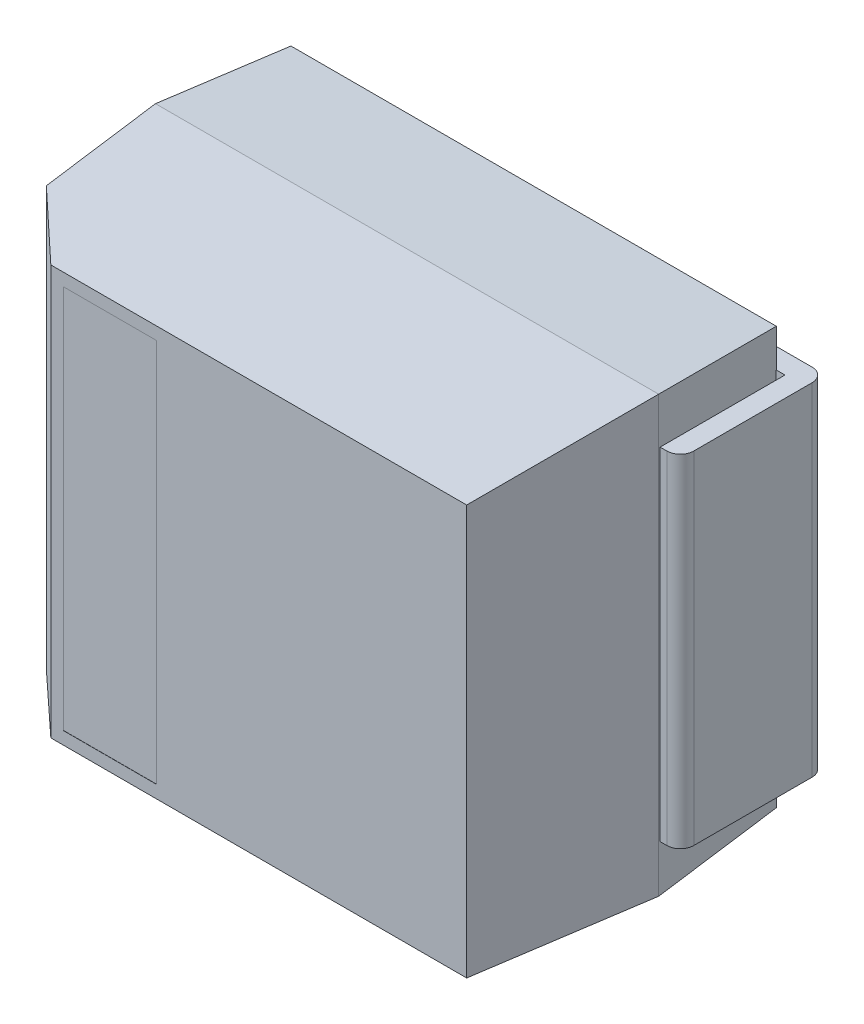
ISO-10303-21;
HEADER;
FILE_DESCRIPTION(('STEP AP214'),'2;1');
FILE_NAME('part.step','',(''),(''),'','','');
FILE_SCHEMA(('AUTOMOTIVE_DESIGN { 1 0 10303 214 1 1 1 1 }'));
ENDSEC;
DATA;
#1=APPLICATION_CONTEXT('core data for automotive mechanical design processes');
#2=APPLICATION_PROTOCOL_DEFINITION('international standard','automotive_design',2000,#1);
#3=PRODUCT_CONTEXT('',#1,'mechanical');
#4=PRODUCT('Part','Part','',(#3));
#5=PRODUCT_RELATED_PRODUCT_CATEGORY('part','',(#4));
#6=PRODUCT_DEFINITION_FORMATION('','',#4);
#7=PRODUCT_DEFINITION_CONTEXT('part definition',#1,'design');
#8=PRODUCT_DEFINITION('design','',#6,#7);
#9=PRODUCT_DEFINITION_SHAPE('','',#8);
#10=(LENGTH_UNIT() NAMED_UNIT(*) SI_UNIT(.MILLI.,.METRE.));
#11=(NAMED_UNIT(*) PLANE_ANGLE_UNIT() SI_UNIT($,.RADIAN.));
#12=(NAMED_UNIT(*) SI_UNIT($,.STERADIAN.) SOLID_ANGLE_UNIT());
#13=UNCERTAINTY_MEASURE_WITH_UNIT(LENGTH_MEASURE(1.E-05),#10,'distance_accuracy_value','');
#14=(GEOMETRIC_REPRESENTATION_CONTEXT(3) GLOBAL_UNCERTAINTY_ASSIGNED_CONTEXT((#13)) GLOBAL_UNIT_ASSIGNED_CONTEXT((#10,
#11,#12)) REPRESENTATION_CONTEXT('',''));
#15=CARTESIAN_POINT('',(0.,0.,0.));
#16=DIRECTION('',(0.,0.,1.));
#17=DIRECTION('',(1.,0.,0.));
#18=AXIS2_PLACEMENT_3D('',#15,#16,#17);
#19=CARTESIAN_POINT('',(-1.75,-1.1,0.));
#20=DIRECTION('',(-1.,0.,0.));
#21=DIRECTION('',(0.,-1.,0.));
#22=AXIS2_PLACEMENT_3D('',#19,#20,#21);
#23=PLANE('',#22);
#24=DIRECTION('',(0.,-1.,0.));
#25=VECTOR('',#24,1.);
#26=CARTESIAN_POINT('',(-1.75,-1.1,0.848883333333));
#27=LINE('',#26,#25);
#28=CARTESIAN_POINT('',(-1.75,0.5,0.848883333333));
#29=VERTEX_POINT('',#28);
#30=CARTESIAN_POINT('',(-1.75,1.1,0.848883333333));
#31=VERTEX_POINT('',#30);
#32=EDGE_CURVE('E170',#29,#31,#27,.F.);
#33=ORIENTED_EDGE('',*,*,#32,.T.);
#34=DIRECTION('',(0.,0.,1.));
#35=VECTOR('',#34,1.);
#36=CARTESIAN_POINT('',(-1.75,1.1,0.));
#37=LINE('',#36,#35);
#38=CARTESIAN_POINT('',(-1.74999999999983,1.1,0.08666666666667));
#39=VERTEX_POINT('',#38);
#40=EDGE_CURVE('E166',#31,#39,#37,.F.);
#41=ORIENTED_EDGE('',*,*,#40,.T.);
#42=DIRECTION('',(0.,1.,0.));
#43=VECTOR('',#42,1.);
#44=CARTESIAN_POINT('',(-1.74999999999967,-1.1,0.08666666666667));
#45=LINE('',#44,#43);
#46=CARTESIAN_POINT('',(-1.74999999999984,-1.1,0.08666666666667));
#47=VERTEX_POINT('',#46);
#48=EDGE_CURVE('E168',#47,#39,#45,.T.);
#49=ORIENTED_EDGE('',*,*,#48,.F.);
#50=DIRECTION('',(0.,0.,1.));
#51=VECTOR('',#50,1.);
#52=CARTESIAN_POINT('',(-1.75,-1.1,0.));
#53=LINE('',#52,#51);
#54=CARTESIAN_POINT('',(-1.75,-1.1,0.848883333333));
#55=VERTEX_POINT('',#54);
#56=EDGE_CURVE('E264',#47,#55,#53,.T.);
#57=ORIENTED_EDGE('',*,*,#56,.T.);
#58=DIRECTION('',(0.,-1.,0.));
#59=VECTOR('',#58,1.);
#60=CARTESIAN_POINT('',(-1.75,-1.1,0.848883333333));
#61=LINE('',#60,#59);
#62=CARTESIAN_POINT('',(-1.75,-0.5,0.848883333333));
#63=VERTEX_POINT('',#62);
#64=EDGE_CURVE('E261',#55,#63,#61,.F.);
#65=ORIENTED_EDGE('',*,*,#64,.T.);
#66=DIRECTION('',(0.,0.,1.));
#67=VECTOR('',#66,1.);
#68=CARTESIAN_POINT('',(-1.75,-0.5,0.));
#69=LINE('',#68,#67);
#70=CARTESIAN_POINT('',(-1.75,-0.5,0.5));
#71=VERTEX_POINT('',#70);
#72=EDGE_CURVE('E263',#63,#71,#69,.F.);
#73=ORIENTED_EDGE('',*,*,#72,.T.);
#74=DIRECTION('',(0.,-1.,0.));
#75=VECTOR('',#74,1.);
#76=CARTESIAN_POINT('',(-1.75,-1.1,0.5));
#77=LINE('',#76,#75);
#78=CARTESIAN_POINT('',(-1.75,0.5,0.5));
#79=VERTEX_POINT('',#78);
#80=EDGE_CURVE('E269',#71,#79,#77,.F.);
#81=ORIENTED_EDGE('',*,*,#80,.T.);
#82=DIRECTION('',(0.,0.,1.));
#83=VECTOR('',#82,1.);
#84=CARTESIAN_POINT('',(-1.75,0.5,0.));
#85=LINE('',#84,#83);
#86=EDGE_CURVE('E274',#79,#29,#85,.T.);
#87=ORIENTED_EDGE('',*,*,#86,.T.);
#88=EDGE_LOOP('',(#33,#41,#49,#57,#65,#73,#81,#87));
#89=FACE_BOUND('',#88,.T.);
#90=ADVANCED_FACE('F16',(#89),#23,.T.);
#91=CARTESIAN_POINT('',(-1.663333333333,-1.1,0.08666666666667));
#92=DIRECTION('',(0.,1.,0.));
#93=DIRECTION('',(-1.,0.,0.));
#94=AXIS2_PLACEMENT_3D('',#91,#92,#93);
#95=CYLINDRICAL_SURFACE('',#94,0.08666666666667);
#96=DIRECTION('',(0.,1.,0.));
#97=VECTOR('',#96,1.);
#98=CARTESIAN_POINT('',(-1.663333333333,0.,0.));
#99=LINE('',#98,#97);
#100=CARTESIAN_POINT('',(-1.663333333333,-1.1,0.));
#101=VERTEX_POINT('',#100);
#102=CARTESIAN_POINT('',(-1.663333333333,1.1,0.));
#103=VERTEX_POINT('',#102);
#104=EDGE_CURVE('E189',#101,#103,#99,.T.);
#105=ORIENTED_EDGE('',*,*,#104,.F.);
#106=CARTESIAN_POINT('',(-1.663333333333,-1.1,0.08666666666667));
#107=DIRECTION('',(0.,1.,0.));
#108=DIRECTION('',(-1.,0.,0.));
#109=AXIS2_PLACEMENT_3D('',#106,#107,#108);
#110=CIRCLE('',#109,0.08666666666667);
#111=EDGE_CURVE('E182',#101,#47,#110,.T.);
#112=ORIENTED_EDGE('',*,*,#111,.T.);
#113=ORIENTED_EDGE('',*,*,#48,.T.);
#114=CARTESIAN_POINT('',(-1.663333333333,1.1,0.08666666666667));
#115=DIRECTION('',(0.,1.,0.));
#116=DIRECTION('',(-1.,0.,0.));
#117=AXIS2_PLACEMENT_3D('',#114,#115,#116);
#118=CIRCLE('',#117,0.08666666666667);
#119=EDGE_CURVE('E20',#39,#103,#118,.F.);
#120=ORIENTED_EDGE('',*,*,#119,.T.);
#121=EDGE_LOOP('',(#105,#112,#113,#120));
#122=FACE_BOUND('',#121,.T.);
#123=ADVANCED_FACE('F179',(#122),#95,.T.);
#124=CARTESIAN_POINT('',(1.241666666667,0.,0.));
#125=DIRECTION('',(0.,0.,-1.));
#126=DIRECTION('',(-1.,0.,0.));
#127=AXIS2_PLACEMENT_3D('',#124,#125,#126);
#128=PLANE('',#127);
#129=DIRECTION('',(0.,-1.,0.));
#130=VECTOR('',#129,1.);
#131=CARTESIAN_POINT('',(1.663333333333,1.1,0.));
#132=LINE('',#131,#130);
#133=CARTESIAN_POINT('',(1.663333333333,-1.1,0.));
#134=VERTEX_POINT('',#133);
#135=CARTESIAN_POINT('',(1.663333333333,1.1,0.));
#136=VERTEX_POINT('',#135);
#137=EDGE_CURVE('E194',#134,#136,#132,.F.);
#138=ORIENTED_EDGE('',*,*,#137,.F.);
#139=DIRECTION('',(-1.,0.,0.));
#140=VECTOR('',#139,1.);
#141=CARTESIAN_POINT('',(1.241666666667,-1.1,0.));
#142=LINE('',#141,#140);
#143=EDGE_CURVE('E195',#134,#101,#142,.T.);
#144=ORIENTED_EDGE('',*,*,#143,.T.);
#145=ORIENTED_EDGE('',*,*,#104,.T.);
#146=DIRECTION('',(-1.,0.,0.));
#147=VECTOR('',#146,1.);
#148=CARTESIAN_POINT('',(1.241666666667,1.1,0.));
#149=LINE('',#148,#147);
#150=EDGE_CURVE('E188',#103,#136,#149,.F.);
#151=ORIENTED_EDGE('',*,*,#150,.T.);
#152=EDGE_LOOP('',(#138,#144,#145,#151));
#153=FACE_BOUND('',#152,.T.);
#154=ADVANCED_FACE('F881',(#153),#128,.T.);
#155=CARTESIAN_POINT('',(1.663333333333,1.1,0.08666666666667));
#156=DIRECTION('',(0.,-1.,0.));
#157=DIRECTION('',(1.,0.,0.));
#158=AXIS2_PLACEMENT_3D('',#155,#156,#157);
#159=CYLINDRICAL_SURFACE('',#158,0.08666666666667);
#160=ORIENTED_EDGE('',*,*,#137,.T.);
#161=CARTESIAN_POINT('',(1.663333333333,1.1,0.08666666666667));
#162=DIRECTION('',(0.,-1.,0.));
#163=DIRECTION('',(1.,0.,0.));
#164=AXIS2_PLACEMENT_3D('',#161,#162,#163);
#165=CIRCLE('',#164,0.08666666666667);
#166=CARTESIAN_POINT('',(1.75,1.1,0.08666666666667));
#167=VERTEX_POINT('',#166);
#168=EDGE_CURVE('E196',#136,#167,#165,.T.);
#169=ORIENTED_EDGE('',*,*,#168,.T.);
#170=DIRECTION('',(0.,1.,0.));
#171=VECTOR('',#170,1.);
#172=CARTESIAN_POINT('',(1.75,1.1,0.08666666666667));
#173=LINE('',#172,#171);
#174=CARTESIAN_POINT('',(1.75,-1.1,0.08666666666667));
#175=VERTEX_POINT('',#174);
#176=EDGE_CURVE('E202',#175,#167,#173,.T.);
#177=ORIENTED_EDGE('',*,*,#176,.F.);
#178=CARTESIAN_POINT('',(1.663333333333,-1.1,0.08666666666667));
#179=DIRECTION('',(0.,-1.,0.));
#180=DIRECTION('',(1.,0.,0.));
#181=AXIS2_PLACEMENT_3D('',#178,#179,#180);
#182=CIRCLE('',#181,0.08666666666667);
#183=EDGE_CURVE('E192',#175,#134,#182,.F.);
#184=ORIENTED_EDGE('',*,*,#183,.T.);
#185=EDGE_LOOP('',(#160,#169,#177,#184));
#186=FACE_BOUND('',#185,.T.);
#187=ADVANCED_FACE('F871',(#186),#159,.T.);
#188=CARTESIAN_POINT('',(1.75,1.1,0.));
#189=DIRECTION('',(1.,0.,0.));
#190=DIRECTION('',(0.,1.,0.));
#191=AXIS2_PLACEMENT_3D('',#188,#189,#190);
#192=PLANE('',#191);
#193=DIRECTION('',(0.,0.,1.));
#194=VECTOR('',#193,1.);
#195=CARTESIAN_POINT('',(1.75,-1.1,0.));
#196=LINE('',#195,#194);
#197=CARTESIAN_POINT('',(1.74999999999983,-1.1,0.848883333333));
#198=VERTEX_POINT('',#197);
#199=EDGE_CURVE('E290',#198,#175,#196,.F.);
#200=ORIENTED_EDGE('',*,*,#199,.T.);
#201=ORIENTED_EDGE('',*,*,#176,.T.);
#202=DIRECTION('',(0.,0.,1.));
#203=VECTOR('',#202,1.);
#204=CARTESIAN_POINT('',(1.75,1.1,0.));
#205=LINE('',#204,#203);
#206=CARTESIAN_POINT('',(1.74999999999984,1.1,0.848883333333));
#207=VERTEX_POINT('',#206);
#208=EDGE_CURVE('E198',#167,#207,#205,.T.);
#209=ORIENTED_EDGE('',*,*,#208,.T.);
#210=DIRECTION('',(0.,-1.,0.));
#211=VECTOR('',#210,1.);
#212=CARTESIAN_POINT('',(1.74999999999967,1.1,0.848883333333));
#213=LINE('',#212,#211);
#214=EDGE_CURVE('E204',#198,#207,#213,.F.);
#215=ORIENTED_EDGE('',*,*,#214,.F.);
#216=EDGE_LOOP('',(#200,#201,#209,#215));
#217=FACE_BOUND('',#216,.T.);
#218=ADVANCED_FACE('F861',(#217),#192,.T.);
#219=CARTESIAN_POINT('',(1.663333333333,1.1,0.848883333333));
#220=DIRECTION('',(0.,-1.,0.));
#221=DIRECTION('',(1.,0.,0.));
#222=AXIS2_PLACEMENT_3D('',#219,#220,#221);
#223=CYLINDRICAL_SURFACE('',#222,0.08666666666667);
#224=CARTESIAN_POINT('',(1.663333333333,-1.1,0.848883333333));
#225=DIRECTION('',(0.,-1.,0.));
#226=DIRECTION('',(1.,0.,0.));
#227=AXIS2_PLACEMENT_3D('',#224,#225,#226);
#228=CIRCLE('',#227,0.08666666666667);
#229=CARTESIAN_POINT('',(1.663333333333,-1.1,0.93555));
#230=VERTEX_POINT('',#229);
#231=EDGE_CURVE('E201',#230,#198,#228,.F.);
#232=ORIENTED_EDGE('',*,*,#231,.T.);
#233=ORIENTED_EDGE('',*,*,#214,.T.);
#234=CARTESIAN_POINT('',(1.663333333333,1.1,0.848883333333));
#235=DIRECTION('',(0.,-1.,0.));
#236=DIRECTION('',(1.,0.,0.));
#237=AXIS2_PLACEMENT_3D('',#234,#235,#236);
#238=CIRCLE('',#237,0.08666666666667);
#239=CARTESIAN_POINT('',(1.663333333333,1.1,0.93555));
#240=VERTEX_POINT('',#239);
#241=EDGE_CURVE('E199',#207,#240,#238,.T.);
#242=ORIENTED_EDGE('',*,*,#241,.T.);
#243=DIRECTION('',(0.,1.,0.));
#244=VECTOR('',#243,1.);
#245=CARTESIAN_POINT('',(1.663333333333,0.,0.93555));
#246=LINE('',#245,#244);
#247=EDGE_CURVE('E296',#240,#230,#246,.F.);
#248=ORIENTED_EDGE('',*,*,#247,.T.);
#249=EDGE_LOOP('',(#232,#233,#242,#248));
#250=FACE_BOUND('',#249,.T.);
#251=ADVANCED_FACE('F851',(#250),#223,.T.);
#252=CARTESIAN_POINT('',(-1.75,0.5,0.5));
#253=DIRECTION('',(0.,1.,0.));
#254=DIRECTION('',(-1.,0.,0.));
#255=AXIS2_PLACEMENT_3D('',#252,#253,#254);
#256=PLANE('',#255);
#257=DIRECTION('',(-1.,0.,0.));
#258=VECTOR('',#257,1.);
#259=CARTESIAN_POINT('',(-1.685,0.5,0.93555));
#260=LINE('',#259,#258);
#261=CARTESIAN_POINT('',(-1.62,0.5,0.93555));
#262=VERTEX_POINT('',#261);
#263=CARTESIAN_POINT('',(-1.663333333333,0.5,0.93555));
#264=VERTEX_POINT('',#263);
#265=EDGE_CURVE('E207',#262,#264,#260,.T.);
#266=ORIENTED_EDGE('',*,*,#265,.T.);
#267=CARTESIAN_POINT('',(-1.663333333333,0.5,0.848883333333));
#268=DIRECTION('',(0.,1.,0.));
#269=DIRECTION('',(-1.,0.,0.));
#270=AXIS2_PLACEMENT_3D('',#267,#268,#269);
#271=CIRCLE('',#270,0.08666666666667);
#272=EDGE_CURVE('E205',#29,#264,#271,.T.);
#273=ORIENTED_EDGE('',*,*,#272,.F.);
#274=ORIENTED_EDGE('',*,*,#86,.F.);
#275=DIRECTION('',(-1.,0.,0.));
#276=VECTOR('',#275,1.);
#277=CARTESIAN_POINT('',(-1.685,0.5,0.5));
#278=LINE('',#277,#276);
#279=CARTESIAN_POINT('',(-1.62,0.5,0.5));
#280=VERTEX_POINT('',#279);
#281=EDGE_CURVE('E294',#79,#280,#278,.F.);
#282=ORIENTED_EDGE('',*,*,#281,.T.);
#283=DIRECTION('',(0.,0.,1.));
#284=VECTOR('',#283,1.);
#285=CARTESIAN_POINT('',(-1.62,0.5,0.));
#286=LINE('',#285,#284);
#287=EDGE_CURVE('E307',#262,#280,#286,.F.);
#288=ORIENTED_EDGE('',*,*,#287,.F.);
#289=EDGE_LOOP('',(#266,#273,#274,#282,#288));
#290=FACE_BOUND('',#289,.T.);
#291=ADVANCED_FACE('F841',(#290),#256,.F.);
#292=CARTESIAN_POINT('',(-1.685,0.,0.5));
#293=DIRECTION('',(0.,0.,-1.));
#294=DIRECTION('',(-1.,0.,0.));
#295=AXIS2_PLACEMENT_3D('',#292,#293,#294);
#296=PLANE('',#295);
#297=ORIENTED_EDGE('',*,*,#281,.F.);
#298=ORIENTED_EDGE('',*,*,#80,.F.);
#299=DIRECTION('',(1.,0.,0.));
#300=VECTOR('',#299,1.);
#301=CARTESIAN_POINT('',(-1.62,-0.5,0.5));
#302=LINE('',#301,#300);
#303=CARTESIAN_POINT('',(-1.62,-0.5,0.5));
#304=VERTEX_POINT('',#303);
#305=EDGE_CURVE('E316',#71,#304,#302,.T.);
#306=ORIENTED_EDGE('',*,*,#305,.T.);
#307=DIRECTION('',(0.,1.,0.));
#308=VECTOR('',#307,1.);
#309=CARTESIAN_POINT('',(-1.62,1.1,0.5));
#310=LINE('',#309,#308);
#311=EDGE_CURVE('E310',#280,#304,#310,.F.);
#312=ORIENTED_EDGE('',*,*,#311,.F.);
#313=EDGE_LOOP('',(#297,#298,#306,#312));
#314=FACE_BOUND('',#313,.T.);
#315=ADVANCED_FACE('F831',(#314),#296,.F.);
#316=CARTESIAN_POINT('',(-1.62,-0.5,0.5));
#317=DIRECTION('',(0.,-1.,0.));
#318=DIRECTION('',(1.,0.,0.));
#319=AXIS2_PLACEMENT_3D('',#316,#317,#318);
#320=PLANE('',#319);
#321=CARTESIAN_POINT('',(-1.663333333333,-0.5,0.848883333333));
#322=DIRECTION('',(0.,1.,0.));
#323=DIRECTION('',(-1.,0.,0.));
#324=AXIS2_PLACEMENT_3D('',#321,#322,#323);
#325=CIRCLE('',#324,0.08666666666667);
#326=CARTESIAN_POINT('',(-1.663333333333,-0.5,0.935549999999835));
#327=VERTEX_POINT('',#326);
#328=EDGE_CURVE('E209',#327,#63,#325,.F.);
#329=ORIENTED_EDGE('',*,*,#328,.F.);
#330=DIRECTION('',(-1.,0.,0.));
#331=VECTOR('',#330,1.);
#332=CARTESIAN_POINT('',(-1.685,-0.5,0.93555));
#333=LINE('',#332,#331);
#334=CARTESIAN_POINT('',(-1.62,-0.5,0.93555));
#335=VERTEX_POINT('',#334);
#336=EDGE_CURVE('E333',#327,#335,#333,.F.);
#337=ORIENTED_EDGE('',*,*,#336,.T.);
#338=DIRECTION('',(0.,0.,1.));
#339=VECTOR('',#338,1.);
#340=CARTESIAN_POINT('',(-1.62,-0.5,0.));
#341=LINE('',#340,#339);
#342=EDGE_CURVE('E321',#304,#335,#341,.T.);
#343=ORIENTED_EDGE('',*,*,#342,.F.);
#344=ORIENTED_EDGE('',*,*,#305,.F.);
#345=ORIENTED_EDGE('',*,*,#72,.F.);
#346=EDGE_LOOP('',(#329,#337,#343,#344,#345));
#347=FACE_BOUND('',#346,.T.);
#348=ADVANCED_FACE('F821',(#347),#320,.F.);
#349=CARTESIAN_POINT('',(1.685,0.,0.93555));
#350=DIRECTION('',(0.,0.,-1.));
#351=DIRECTION('',(-1.,0.,0.));
#352=AXIS2_PLACEMENT_3D('',#349,#350,#351);
#353=PLANE('',#352);
#354=DIRECTION('',(-1.,0.,0.));
#355=VECTOR('',#354,1.);
#356=CARTESIAN_POINT('',(1.685,-1.1,0.93555));
#357=LINE('',#356,#355);
#358=CARTESIAN_POINT('',(1.62,-1.1,0.93555));
#359=VERTEX_POINT('',#358);
#360=EDGE_CURVE('E208',#230,#359,#357,.T.);
#361=ORIENTED_EDGE('',*,*,#360,.F.);
#362=ORIENTED_EDGE('',*,*,#247,.F.);
#363=DIRECTION('',(-1.,0.,0.));
#364=VECTOR('',#363,1.);
#365=CARTESIAN_POINT('',(1.685,1.1,0.93555));
#366=LINE('',#365,#364);
#367=CARTESIAN_POINT('',(1.62,1.1,0.93555));
#368=VERTEX_POINT('',#367);
#369=EDGE_CURVE('E299',#368,#240,#366,.F.);
#370=ORIENTED_EDGE('',*,*,#369,.F.);
#371=DIRECTION('',(0.,-1.,0.));
#372=VECTOR('',#371,1.);
#373=CARTESIAN_POINT('',(1.62,-1.1,0.93555));
#374=LINE('',#373,#372);
#375=EDGE_CURVE('E212',#359,#368,#374,.F.);
#376=ORIENTED_EDGE('',*,*,#375,.F.);
#377=EDGE_LOOP('',(#361,#362,#370,#376));
#378=FACE_BOUND('',#377,.T.);
#379=ADVANCED_FACE('F811',(#378),#353,.F.);
#380=CARTESIAN_POINT('',(-1.663333333333,-1.1,0.848883333333));
#381=DIRECTION('',(0.,1.,0.));
#382=DIRECTION('',(-1.,0.,0.));
#383=AXIS2_PLACEMENT_3D('',#380,#381,#382);
#384=CYLINDRICAL_SURFACE('',#383,0.08666666666667);
#385=DIRECTION('',(0.,1.,0.));
#386=VECTOR('',#385,1.);
#387=CARTESIAN_POINT('',(-1.663333333333,0.,0.93555));
#388=LINE('',#387,#386);
#389=CARTESIAN_POINT('',(-1.663333333333,1.1,0.93555));
#390=VERTEX_POINT('',#389);
#391=EDGE_CURVE('E304',#264,#390,#388,.T.);
#392=ORIENTED_EDGE('',*,*,#391,.T.);
#393=CARTESIAN_POINT('',(-1.663333333333,1.1,0.848883333333));
#394=DIRECTION('',(0.,1.,0.));
#395=DIRECTION('',(-1.,0.,0.));
#396=AXIS2_PLACEMENT_3D('',#393,#394,#395);
#397=CIRCLE('',#396,0.08666666666667);
#398=EDGE_CURVE('E214',#31,#390,#397,.T.);
#399=ORIENTED_EDGE('',*,*,#398,.F.);
#400=ORIENTED_EDGE('',*,*,#32,.F.);
#401=ORIENTED_EDGE('',*,*,#272,.T.);
#402=EDGE_LOOP('',(#392,#399,#400,#401));
#403=FACE_BOUND('',#402,.T.);
#404=ADVANCED_FACE('F801',(#403),#384,.T.);
#405=CARTESIAN_POINT('',(-1.685,0.,0.93555));
#406=DIRECTION('',(0.,0.,-1.));
#407=DIRECTION('',(-1.,0.,0.));
#408=AXIS2_PLACEMENT_3D('',#405,#406,#407);
#409=PLANE('',#408);
#410=DIRECTION('',(-1.,0.,0.));
#411=VECTOR('',#410,1.);
#412=CARTESIAN_POINT('',(-1.45087948265,1.1,0.93555));
#413=LINE('',#412,#411);
#414=CARTESIAN_POINT('',(-1.62,1.1,0.93555));
#415=VERTEX_POINT('',#414);
#416=EDGE_CURVE('E216',#390,#415,#413,.F.);
#417=ORIENTED_EDGE('',*,*,#416,.F.);
#418=ORIENTED_EDGE('',*,*,#391,.F.);
#419=ORIENTED_EDGE('',*,*,#265,.F.);
#420=DIRECTION('',(0.,1.,0.));
#421=VECTOR('',#420,1.);
#422=CARTESIAN_POINT('',(-1.62,1.1,0.93555));
#423=LINE('',#422,#421);
#424=EDGE_CURVE('E311',#415,#262,#423,.F.);
#425=ORIENTED_EDGE('',*,*,#424,.F.);
#426=EDGE_LOOP('',(#417,#418,#419,#425));
#427=FACE_BOUND('',#426,.T.);
#428=ADVANCED_FACE('F791',(#427),#409,.F.);
#429=CARTESIAN_POINT('',(-1.62,1.1,0.));
#430=DIRECTION('',(1.,0.,0.));
#431=DIRECTION('',(0.,1.,0.));
#432=AXIS2_PLACEMENT_3D('',#429,#430,#431);
#433=PLANE('',#432);
#434=DIRECTION('',(0.,1.,0.));
#435=VECTOR('',#434,1.);
#436=CARTESIAN_POINT('',(-1.62,0.,0.93555));
#437=LINE('',#436,#435);
#438=CARTESIAN_POINT('',(-1.62,-1.1,0.93555));
#439=VERTEX_POINT('',#438);
#440=EDGE_CURVE('E336',#335,#439,#437,.F.);
#441=ORIENTED_EDGE('',*,*,#440,.T.);
#442=DIRECTION('',(0.,0.,1.));
#443=VECTOR('',#442,1.);
#444=CARTESIAN_POINT('',(-1.62,-1.1,0.));
#445=LINE('',#444,#443);
#446=CARTESIAN_POINT('',(-1.62,-1.1,0.1313));
#447=VERTEX_POINT('',#446);
#448=EDGE_CURVE('E330',#439,#447,#445,.F.);
#449=ORIENTED_EDGE('',*,*,#448,.T.);
#450=DIRECTION('',(0.,1.,0.));
#451=VECTOR('',#450,1.);
#452=CARTESIAN_POINT('',(-1.62,0.,0.1313));
#453=LINE('',#452,#451);
#454=CARTESIAN_POINT('',(-1.62,1.1,0.1313));
#455=VERTEX_POINT('',#454);
#456=EDGE_CURVE('E359',#447,#455,#453,.T.);
#457=ORIENTED_EDGE('',*,*,#456,.T.);
#458=DIRECTION('',(0.,0.,1.));
#459=VECTOR('',#458,1.);
#460=CARTESIAN_POINT('',(-1.62,1.1,0.291674963104));
#461=LINE('',#460,#459);
#462=EDGE_CURVE('E356',#415,#455,#461,.F.);
#463=ORIENTED_EDGE('',*,*,#462,.F.);
#464=ORIENTED_EDGE('',*,*,#424,.T.);
#465=ORIENTED_EDGE('',*,*,#287,.T.);
#466=ORIENTED_EDGE('',*,*,#311,.T.);
#467=ORIENTED_EDGE('',*,*,#342,.T.);
#468=EDGE_LOOP('',(#441,#449,#457,#463,#464,#465,#466,#467));
#469=FACE_BOUND('',#468,.T.);
#470=ADVANCED_FACE('F781',(#469),#433,.T.);
#471=CARTESIAN_POINT('',(-1.685,0.,0.93555));
#472=DIRECTION('',(0.,0.,-1.));
#473=DIRECTION('',(-1.,0.,0.));
#474=AXIS2_PLACEMENT_3D('',#471,#472,#473);
#475=PLANE('',#474);
#476=ORIENTED_EDGE('',*,*,#336,.F.);
#477=DIRECTION('',(0.,1.,0.));
#478=VECTOR('',#477,1.);
#479=CARTESIAN_POINT('',(-1.663333333333,-1.1,0.93554999999967));
#480=LINE('',#479,#478);
#481=CARTESIAN_POINT('',(-1.663333333333,-1.1,0.935549999999835));
#482=VERTEX_POINT('',#481);
#483=EDGE_CURVE('E213',#482,#327,#480,.T.);
#484=ORIENTED_EDGE('',*,*,#483,.F.);
#485=DIRECTION('',(1.,0.,0.));
#486=VECTOR('',#485,1.);
#487=CARTESIAN_POINT('',(-1.45087948265,-1.1,0.93555));
#488=LINE('',#487,#486);
#489=EDGE_CURVE('E222',#439,#482,#488,.F.);
#490=ORIENTED_EDGE('',*,*,#489,.F.);
#491=ORIENTED_EDGE('',*,*,#440,.F.);
#492=EDGE_LOOP('',(#476,#484,#490,#491));
#493=FACE_BOUND('',#492,.T.);
#494=ADVANCED_FACE('F771',(#493),#475,.F.);
#495=CARTESIAN_POINT('',(-1.663333333333,-1.1,0.848883333333));
#496=DIRECTION('',(0.,1.,0.));
#497=DIRECTION('',(-1.,0.,0.));
#498=AXIS2_PLACEMENT_3D('',#495,#496,#497);
#499=CYLINDRICAL_SURFACE('',#498,0.08666666666667);
#500=ORIENTED_EDGE('',*,*,#483,.T.);
#501=ORIENTED_EDGE('',*,*,#328,.T.);
#502=ORIENTED_EDGE('',*,*,#64,.F.);
#503=CARTESIAN_POINT('',(-1.663333333333,-1.1,0.848883333333));
#504=DIRECTION('',(0.,1.,0.));
#505=DIRECTION('',(-1.,0.,0.));
#506=AXIS2_PLACEMENT_3D('',#503,#504,#505);
#507=CIRCLE('',#506,0.08666666666667);
#508=EDGE_CURVE('E218',#482,#55,#507,.F.);
#509=ORIENTED_EDGE('',*,*,#508,.F.);
#510=EDGE_LOOP('',(#500,#501,#502,#509));
#511=FACE_BOUND('',#510,.T.);
#512=ADVANCED_FACE('F761',(#511),#499,.T.);
#513=CARTESIAN_POINT('',(1.62,-1.1,0.));
#514=DIRECTION('',(-1.,0.,0.));
#515=DIRECTION('',(0.,-1.,0.));
#516=AXIS2_PLACEMENT_3D('',#513,#514,#515);
#517=PLANE('',#516);
#518=ORIENTED_EDGE('',*,*,#375,.T.);
#519=DIRECTION('',(0.,0.,1.));
#520=VECTOR('',#519,1.);
#521=CARTESIAN_POINT('',(1.62,1.1,0.));
#522=LINE('',#521,#520);
#523=CARTESIAN_POINT('',(1.62,1.1,0.1313));
#524=VERTEX_POINT('',#523);
#525=EDGE_CURVE('E217',#368,#524,#522,.F.);
#526=ORIENTED_EDGE('',*,*,#525,.T.);
#527=DIRECTION('',(0.,1.,0.));
#528=VECTOR('',#527,1.);
#529=CARTESIAN_POINT('',(1.62,0.,0.1313));
#530=LINE('',#529,#528);
#531=CARTESIAN_POINT('',(1.62,-1.1,0.1313));
#532=VERTEX_POINT('',#531);
#533=EDGE_CURVE('E384',#524,#532,#530,.F.);
#534=ORIENTED_EDGE('',*,*,#533,.T.);
#535=DIRECTION('',(0.,0.,1.));
#536=VECTOR('',#535,1.);
#537=CARTESIAN_POINT('',(1.62,-1.1,0.291674963104));
#538=LINE('',#537,#536);
#539=EDGE_CURVE('E381',#359,#532,#538,.F.);
#540=ORIENTED_EDGE('',*,*,#539,.F.);
#541=EDGE_LOOP('',(#518,#526,#534,#540));
#542=FACE_BOUND('',#541,.T.);
#543=ADVANCED_FACE('F751',(#542),#517,.T.);
#544=CARTESIAN_POINT('',(-1.22,0.,0.1313));
#545=DIRECTION('',(0.,0.,-1.));
#546=DIRECTION('',(-1.,0.,0.));
#547=AXIS2_PLACEMENT_3D('',#544,#545,#546);
#548=PLANE('',#547);
#549=ORIENTED_EDGE('',*,*,#456,.F.);
#550=DIRECTION('',(1.,0.,0.));
#551=VECTOR('',#550,1.);
#552=CARTESIAN_POINT('',(-1.45087948265,-1.1,0.1313));
#553=LINE('',#552,#551);
#554=CARTESIAN_POINT('',(-1.56282096140155,-1.1,0.131299999999981));
#555=VERTEX_POINT('',#554);
#556=EDGE_CURVE('E398',#555,#447,#553,.F.);
#557=ORIENTED_EDGE('',*,*,#556,.F.);
#558=DIRECTION('',(0.,-1.,0.));
#559=VECTOR('',#558,1.);
#560=CARTESIAN_POINT('',(-1.56282096140155,0.,0.131299999999961));
#561=LINE('',#560,#559);
#562=CARTESIAN_POINT('',(-1.56282096140155,1.1,0.131299999999981));
#563=VERTEX_POINT('',#562);
#564=EDGE_CURVE('E225',#563,#555,#561,.T.);
#565=ORIENTED_EDGE('',*,*,#564,.F.);
#566=DIRECTION('',(-1.,0.,0.));
#567=VECTOR('',#566,1.);
#568=CARTESIAN_POINT('',(-1.22,1.1,0.1313));
#569=LINE('',#568,#567);
#570=EDGE_CURVE('E364',#455,#563,#569,.F.);
#571=ORIENTED_EDGE('',*,*,#570,.F.);
#572=EDGE_LOOP('',(#549,#557,#565,#571));
#573=FACE_BOUND('',#572,.T.);
#574=ADVANCED_FACE('F741',(#573),#548,.F.);
#575=CARTESIAN_POINT('',(1.562729609859,-1.342729609859,0.13));
#576=DIRECTION('',(0.,0.,-1.));
#577=DIRECTION('',(-1.,0.,0.));
#578=AXIS2_PLACEMENT_3D('',#575,#576,#577);
#579=PLANE('',#578);
#580=DIRECTION('',(0.,-1.,0.));
#581=VECTOR('',#580,1.);
#582=CARTESIAN_POINT('',(-1.562729609859,0.,0.13));
#583=LINE('',#582,#581);
#584=CARTESIAN_POINT('',(-1.562729609859,1.342729609859,0.13));
#585=VERTEX_POINT('',#584);
#586=CARTESIAN_POINT('',(-1.562729609859,1.1,0.13));
#587=VERTEX_POINT('',#586);
#588=EDGE_CURVE('E226',#585,#587,#583,.T.);
#589=ORIENTED_EDGE('',*,*,#588,.F.);
#590=DIRECTION('',(-1.,0.,0.));
#591=VECTOR('',#590,1.);
#592=CARTESIAN_POINT('',(0.,1.342729609859,0.13));
#593=LINE('',#592,#591);
#594=CARTESIAN_POINT('',(1.562729609859,1.342729609859,0.13));
#595=VERTEX_POINT('',#594);
#596=EDGE_CURVE('E429',#595,#585,#593,.T.);
#597=ORIENTED_EDGE('',*,*,#596,.F.);
#598=DIRECTION('',(0.,1.,0.));
#599=VECTOR('',#598,1.);
#600=CARTESIAN_POINT('',(1.562729609859,-1.342729609859,0.13));
#601=LINE('',#600,#599);
#602=CARTESIAN_POINT('',(1.562729609859,1.1,0.13));
#603=VERTEX_POINT('',#602);
#604=EDGE_CURVE('E221',#595,#603,#601,.F.);
#605=ORIENTED_EDGE('',*,*,#604,.T.);
#606=DIRECTION('',(-1.,0.,0.));
#607=VECTOR('',#606,1.);
#608=CARTESIAN_POINT('',(1.45087948265,1.1,0.13));
#609=LINE('',#608,#607);
#610=EDGE_CURVE('E418',#587,#603,#609,.F.);
#611=ORIENTED_EDGE('',*,*,#610,.F.);
#612=EDGE_LOOP('',(#589,#597,#605,#611));
#613=FACE_BOUND('',#612,.T.);
#614=ADVANCED_FACE('F731',(#613),#579,.T.);
#615=CARTESIAN_POINT('',(1.45087948265,-1.1,0.291674963104));
#616=DIRECTION('',(0.,-1.,0.));
#617=DIRECTION('',(1.,0.,0.));
#618=AXIS2_PLACEMENT_3D('',#615,#616,#617);
#619=PLANE('',#618);
#620=DIRECTION('',(-1.,0.,0.));
#621=VECTOR('',#620,1.);
#622=CARTESIAN_POINT('',(1.562729609859,-1.1,0.13));
#623=LINE('',#622,#621);
#624=CARTESIAN_POINT('',(-1.562729609859,-1.1,0.13));
#625=VERTEX_POINT('',#624);
#626=CARTESIAN_POINT('',(1.562729609859,-1.1,0.13));
#627=VERTEX_POINT('',#626);
#628=EDGE_CURVE('E411',#625,#627,#623,.F.);
#629=ORIENTED_EDGE('',*,*,#628,.F.);
#630=DIRECTION('',(-0.0700975619934905,0.,0.997540140446774));
#631=VECTOR('',#630,1.);
#632=CARTESIAN_POINT('',(-1.562729609859,-1.1,0.13));
#633=LINE('',#632,#631);
#634=EDGE_CURVE('E227',#555,#625,#633,.F.);
#635=ORIENTED_EDGE('',*,*,#634,.F.);
#636=ORIENTED_EDGE('',*,*,#556,.T.);
#637=ORIENTED_EDGE('',*,*,#448,.F.);
#638=ORIENTED_EDGE('',*,*,#489,.T.);
#639=ORIENTED_EDGE('',*,*,#508,.T.);
#640=ORIENTED_EDGE('',*,*,#56,.F.);
#641=ORIENTED_EDGE('',*,*,#111,.F.);
#642=ORIENTED_EDGE('',*,*,#143,.F.);
#643=ORIENTED_EDGE('',*,*,#183,.F.);
#644=ORIENTED_EDGE('',*,*,#199,.F.);
#645=ORIENTED_EDGE('',*,*,#231,.F.);
#646=ORIENTED_EDGE('',*,*,#360,.T.);
#647=ORIENTED_EDGE('',*,*,#539,.T.);
#648=DIRECTION('',(-1.,0.,0.));
#649=VECTOR('',#648,1.);
#650=CARTESIAN_POINT('',(1.22,-1.1,0.1313));
#651=LINE('',#650,#649);
#652=CARTESIAN_POINT('',(1.56282096140155,-1.1,0.131299999999981));
#653=VERTEX_POINT('',#652);
#654=EDGE_CURVE('E389',#532,#653,#651,.T.);
#655=ORIENTED_EDGE('',*,*,#654,.T.);
#656=DIRECTION('',(0.0700975619934905,0.,0.997540140446774));
#657=VECTOR('',#656,1.);
#658=CARTESIAN_POINT('',(1.562729609859,-1.1,0.13));
#659=LINE('',#658,#657);
#660=EDGE_CURVE('E231',#627,#653,#659,.T.);
#661=ORIENTED_EDGE('',*,*,#660,.F.);
#662=EDGE_LOOP('',(#629,#635,#636,#637,#638,#639,#640,#641,#642,#643,#644,#645,#646,#647,#655,#661));
#663=FACE_BOUND('',#662,.T.);
#664=ADVANCED_FACE('F721',(#663),#619,.T.);
#665=CARTESIAN_POINT('',(1.22,0.,0.1313));
#666=DIRECTION('',(0.,0.,-1.));
#667=DIRECTION('',(-1.,0.,0.));
#668=AXIS2_PLACEMENT_3D('',#665,#666,#667);
#669=PLANE('',#668);
#670=ORIENTED_EDGE('',*,*,#533,.F.);
#671=DIRECTION('',(-1.,0.,0.));
#672=VECTOR('',#671,1.);
#673=CARTESIAN_POINT('',(1.45087948265,1.1,0.1313));
#674=LINE('',#673,#672);
#675=CARTESIAN_POINT('',(1.56282096140155,1.1,0.131299999999981));
#676=VERTEX_POINT('',#675);
#677=EDGE_CURVE('E413',#676,#524,#674,.F.);
#678=ORIENTED_EDGE('',*,*,#677,.F.);
#679=DIRECTION('',(0.,1.,0.));
#680=VECTOR('',#679,1.);
#681=CARTESIAN_POINT('',(1.56282096140155,0.,0.131299999999961));
#682=LINE('',#681,#680);
#683=EDGE_CURVE('E233',#653,#676,#682,.T.);
#684=ORIENTED_EDGE('',*,*,#683,.F.);
#685=ORIENTED_EDGE('',*,*,#654,.F.);
#686=EDGE_LOOP('',(#670,#678,#684,#685));
#687=FACE_BOUND('',#686,.T.);
#688=ADVANCED_FACE('F712',(#687),#669,.F.);
#689=CARTESIAN_POINT('',(1.45087948265,1.1,0.291674963104));
#690=DIRECTION('',(0.,1.,0.));
#691=DIRECTION('',(-1.,0.,0.));
#692=AXIS2_PLACEMENT_3D('',#689,#690,#691);
#693=PLANE('',#692);
#694=ORIENTED_EDGE('',*,*,#369,.T.);
#695=ORIENTED_EDGE('',*,*,#241,.F.);
#696=ORIENTED_EDGE('',*,*,#208,.F.);
#697=ORIENTED_EDGE('',*,*,#168,.F.);
#698=ORIENTED_EDGE('',*,*,#150,.F.);
#699=ORIENTED_EDGE('',*,*,#119,.F.);
#700=ORIENTED_EDGE('',*,*,#40,.F.);
#701=ORIENTED_EDGE('',*,*,#398,.T.);
#702=ORIENTED_EDGE('',*,*,#416,.T.);
#703=ORIENTED_EDGE('',*,*,#462,.T.);
#704=ORIENTED_EDGE('',*,*,#570,.T.);
#705=DIRECTION('',(-0.0700975619934905,0.,0.997540140446774));
#706=VECTOR('',#705,1.);
#707=CARTESIAN_POINT('',(-1.562729609859,1.1,0.13));
#708=LINE('',#707,#706);
#709=EDGE_CURVE('E223',#587,#563,#708,.T.);
#710=ORIENTED_EDGE('',*,*,#709,.F.);
#711=ORIENTED_EDGE('',*,*,#610,.T.);
#712=DIRECTION('',(0.0700975619934905,0.,0.997540140446774));
#713=VECTOR('',#712,1.);
#714=CARTESIAN_POINT('',(1.562729609859,1.1,0.13));
#715=LINE('',#714,#713);
#716=EDGE_CURVE('E235',#676,#603,#715,.F.);
#717=ORIENTED_EDGE('',*,*,#716,.F.);
#718=ORIENTED_EDGE('',*,*,#677,.T.);
#719=ORIENTED_EDGE('',*,*,#525,.F.);
#720=EDGE_LOOP('',(#694,#695,#696,#697,#698,#699,#700,#701,#702,#703,#704,#710,#711,#717,#718,#719));
#721=FACE_BOUND('',#720,.T.);
#722=ADVANCED_FACE('F186',(#721),#693,.T.);
#723=CARTESIAN_POINT('',(1.562729609859,-1.342729609859,0.13));
#724=DIRECTION('',(0.,0.,-1.));
#725=DIRECTION('',(-1.,0.,0.));
#726=AXIS2_PLACEMENT_3D('',#723,#724,#725);
#727=PLANE('',#726);
#728=DIRECTION('',(0.,-1.,0.));
#729=VECTOR('',#728,1.);
#730=CARTESIAN_POINT('',(-1.562729609859,0.,0.13));
#731=LINE('',#730,#729);
#732=CARTESIAN_POINT('',(-1.562729609859,-1.342729609859,0.13));
#733=VERTEX_POINT('',#732);
#734=EDGE_CURVE('E230',#625,#733,#731,.T.);
#735=ORIENTED_EDGE('',*,*,#734,.F.);
#736=ORIENTED_EDGE('',*,*,#628,.T.);
#737=DIRECTION('',(0.,1.,0.));
#738=VECTOR('',#737,1.);
#739=CARTESIAN_POINT('',(1.562729609859,0.,0.13));
#740=LINE('',#739,#738);
#741=CARTESIAN_POINT('',(1.562729609859,-1.342729609859,0.13));
#742=VERTEX_POINT('',#741);
#743=EDGE_CURVE('E234',#742,#627,#740,.T.);
#744=ORIENTED_EDGE('',*,*,#743,.F.);
#745=DIRECTION('',(1.,0.,0.));
#746=VECTOR('',#745,1.);
#747=CARTESIAN_POINT('',(0.,-1.342729609859,0.13));
#748=LINE('',#747,#746);
#749=EDGE_CURVE('E435',#733,#742,#748,.T.);
#750=ORIENTED_EDGE('',*,*,#749,.F.);
#751=EDGE_LOOP('',(#735,#736,#744,#750));
#752=FACE_BOUND('',#751,.T.);
#753=ADVANCED_FACE('F693',(#752),#727,.T.);
#754=CARTESIAN_POINT('',(-1.562729609859,1.342729609859,0.13));
#755=DIRECTION('',(-0.997540140446774,0.,-0.0700975619934905));
#756=DIRECTION('',(0.,-1.,0.));
#757=AXIS2_PLACEMENT_3D('',#754,#755,#756);
#758=PLANE('',#757);
#759=DIRECTION('',(0.0699259759921659,0.0699259759921657,-0.995098344769544));
#760=VECTOR('',#759,1.);
#761=CARTESIAN_POINT('',(-1.5913648049295,-1.3713648049295,0.5375));
#762=LINE('',#761,#760);
#763=CARTESIAN_POINT('',(-1.62,-1.4,0.945));
#764=VERTEX_POINT('',#763);
#765=EDGE_CURVE('E473',#764,#733,#762,.T.);
#766=ORIENTED_EDGE('',*,*,#765,.F.);
#767=DIRECTION('',(0.,-1.,0.));
#768=VECTOR('',#767,1.);
#769=CARTESIAN_POINT('',(-1.62,0.,0.945));
#770=LINE('',#769,#768);
#771=CARTESIAN_POINT('',(-1.62,1.4,0.945));
#772=VERTEX_POINT('',#771);
#773=EDGE_CURVE('E470',#772,#764,#770,.T.);
#774=ORIENTED_EDGE('',*,*,#773,.F.);
#775=DIRECTION('',(-0.0699259759921659,0.0699259759921657,0.995098344769544));
#776=VECTOR('',#775,1.);
#777=CARTESIAN_POINT('',(-1.5913648049295,1.3713648049295,0.5375));
#778=LINE('',#777,#776);
#779=EDGE_CURVE('E432',#585,#772,#778,.T.);
#780=ORIENTED_EDGE('',*,*,#779,.F.);
#781=ORIENTED_EDGE('',*,*,#588,.T.);
#782=ORIENTED_EDGE('',*,*,#709,.T.);
#783=ORIENTED_EDGE('',*,*,#564,.T.);
#784=ORIENTED_EDGE('',*,*,#634,.T.);
#785=ORIENTED_EDGE('',*,*,#734,.T.);
#786=EDGE_LOOP('',(#766,#774,#780,#781,#782,#783,#784,#785));
#787=FACE_BOUND('',#786,.T.);
#788=ADVANCED_FACE('F683',(#787),#758,.T.);
#789=CARTESIAN_POINT('',(1.562729609859,1.342729609859,0.13));
#790=DIRECTION('',(0.,0.997540140446774,-0.0700975619934903));
#791=DIRECTION('',(-1.,0.,0.));
#792=AXIS2_PLACEMENT_3D('',#789,#790,#791);
#793=PLANE('',#792);
#794=DIRECTION('',(-1.,0.,0.));
#795=VECTOR('',#794,1.);
#796=CARTESIAN_POINT('',(0.,1.4,0.945));
#797=LINE('',#796,#795);
#798=CARTESIAN_POINT('',(1.62,1.4,0.945));
#799=VERTEX_POINT('',#798);
#800=EDGE_CURVE('E463',#799,#772,#797,.T.);
#801=ORIENTED_EDGE('',*,*,#800,.F.);
#802=DIRECTION('',(0.0699259759921659,0.0699259759921657,0.995098344769544));
#803=VECTOR('',#802,1.);
#804=CARTESIAN_POINT('',(1.5913648049295,1.3713648049295,0.5375));
#805=LINE('',#804,#803);
#806=EDGE_CURVE('E238',#595,#799,#805,.T.);
#807=ORIENTED_EDGE('',*,*,#806,.F.);
#808=ORIENTED_EDGE('',*,*,#596,.T.);
#809=ORIENTED_EDGE('',*,*,#779,.T.);
#810=EDGE_LOOP('',(#801,#807,#808,#809));
#811=FACE_BOUND('',#810,.T.);
#812=ADVANCED_FACE('F673',(#811),#793,.T.);
#813=CARTESIAN_POINT('',(1.562729609859,-1.342729609859,0.13));
#814=DIRECTION('',(0.997540140446774,0.,-0.0700975619934905));
#815=DIRECTION('',(0.,1.,0.));
#816=AXIS2_PLACEMENT_3D('',#813,#814,#815);
#817=PLANE('',#816);
#818=ORIENTED_EDGE('',*,*,#806,.T.);
#819=DIRECTION('',(0.,1.,0.));
#820=VECTOR('',#819,1.);
#821=CARTESIAN_POINT('',(1.62,0.,0.945));
#822=LINE('',#821,#820);
#823=CARTESIAN_POINT('',(1.62,-1.4,0.945));
#824=VERTEX_POINT('',#823);
#825=EDGE_CURVE('E466',#824,#799,#822,.T.);
#826=ORIENTED_EDGE('',*,*,#825,.F.);
#827=DIRECTION('',(0.0699259759921659,-0.0699259759921657,0.995098344769544));
#828=VECTOR('',#827,1.);
#829=CARTESIAN_POINT('',(1.5913648049295,-1.3713648049295,0.5375));
#830=LINE('',#829,#828);
#831=EDGE_CURVE('E438',#742,#824,#830,.T.);
#832=ORIENTED_EDGE('',*,*,#831,.F.);
#833=ORIENTED_EDGE('',*,*,#743,.T.);
#834=ORIENTED_EDGE('',*,*,#660,.T.);
#835=ORIENTED_EDGE('',*,*,#683,.T.);
#836=ORIENTED_EDGE('',*,*,#716,.T.);
#837=ORIENTED_EDGE('',*,*,#604,.F.);
#838=EDGE_LOOP('',(#818,#826,#832,#833,#834,#835,#836,#837));
#839=FACE_BOUND('',#838,.T.);
#840=ADVANCED_FACE('F663',(#839),#817,.T.);
#841=CARTESIAN_POINT('',(-1.562729609859,-1.342729609859,0.13));
#842=DIRECTION('',(0.,-0.997540140446774,-0.0700975619934903));
#843=DIRECTION('',(1.,0.,0.));
#844=AXIS2_PLACEMENT_3D('',#841,#842,#843);
#845=PLANE('',#844);
#846=DIRECTION('',(1.,0.,0.));
#847=VECTOR('',#846,1.);
#848=CARTESIAN_POINT('',(0.,-1.4,0.945));
#849=LINE('',#848,#847);
#850=EDGE_CURVE('E484',#764,#824,#849,.T.);
#851=ORIENTED_EDGE('',*,*,#850,.F.);
#852=ORIENTED_EDGE('',*,*,#765,.T.);
#853=ORIENTED_EDGE('',*,*,#749,.T.);
#854=ORIENTED_EDGE('',*,*,#831,.T.);
#855=EDGE_LOOP('',(#851,#852,#853,#854));
#856=FACE_BOUND('',#855,.T.);
#857=ADVANCED_FACE('F653',(#856),#845,.T.);
#858=CARTESIAN_POINT('',(-1.62,1.4,0.945));
#859=DIRECTION('',(-0.997540140446732,0.,0.0700975619940811));
#860=DIRECTION('',(0.,-1.,0.));
#861=AXIS2_PLACEMENT_3D('',#858,#859,#860);
#862=PLANE('',#861);
#863=DIRECTION('',(0.0699259759927522,-0.069925975992752,0.995098344769461));
#864=VECTOR('',#863,1.);
#865=CARTESIAN_POINT('',(-1.5794188339795,1.3594188339795,1.5225));
#866=LINE('',#865,#864);
#867=CARTESIAN_POINT('',(-1.56687669275681,1.34687669275664,1.70098394382116));
#868=VERTEX_POINT('',#867);
#869=EDGE_CURVE('E467',#772,#868,#866,.T.);
#870=ORIENTED_EDGE('',*,*,#869,.F.);
#871=ORIENTED_EDGE('',*,*,#773,.T.);
#872=DIRECTION('',(-0.0699259759927522,-0.069925975992752,-0.995098344769461));
#873=VECTOR('',#872,1.);
#874=CARTESIAN_POINT('',(-1.5794188339795,-1.3594188339795,1.5225));
#875=LINE('',#874,#873);
#876=CARTESIAN_POINT('',(-1.56687669275681,-1.34687669275664,1.70098394382116));
#877=VERTEX_POINT('',#876);
#878=EDGE_CURVE('E487',#877,#764,#875,.T.);
#879=ORIENTED_EDGE('',*,*,#878,.F.);
#880=DIRECTION('',(0.,1.,0.));
#881=VECTOR('',#880,1.);
#882=CARTESIAN_POINT('',(-1.566876692757,1.91415893552316E-13,1.700983943821));
#883=LINE('',#882,#881);
#884=EDGE_CURVE('E246',#877,#868,#883,.T.);
#885=ORIENTED_EDGE('',*,*,#884,.T.);
#886=EDGE_LOOP('',(#870,#871,#879,#885));
#887=FACE_BOUND('',#886,.T.);
#888=ADVANCED_FACE('F644',(#887),#862,.T.);
#889=CARTESIAN_POINT('',(-0.457675335919,-1.237675335919,2.0987));
#890=DIRECTION('',(0.,0.,-1.));
#891=DIRECTION('',(-1.,0.,0.));
#892=AXIS2_PLACEMENT_3D('',#889,#890,#891);
#893=PLANE('',#892);
#894=DIRECTION('',(-1.,0.,0.));
#895=VECTOR('',#894,1.);
#896=CARTESIAN_POINT('',(-0.457675335919,1.237675335919,2.0987));
#897=LINE('',#896,#895);
#898=CARTESIAN_POINT('',(-0.457675335919,1.237675335919,2.0987));
#899=VERTEX_POINT('',#898);
#900=CARTESIAN_POINT('',(-1.057675335919,1.237675335919,2.0987));
#901=VERTEX_POINT('',#900);
#902=EDGE_CURVE('E495',#899,#901,#897,.T.);
#903=ORIENTED_EDGE('',*,*,#902,.T.);
#904=DIRECTION('',(0.,-1.,0.));
#905=VECTOR('',#904,1.);
#906=CARTESIAN_POINT('',(-1.057675335919,1.237675335919,2.0987));
#907=LINE('',#906,#905);
#908=CARTESIAN_POINT('',(-1.057675335919,-1.237675335919,2.0987));
#909=VERTEX_POINT('',#908);
#910=EDGE_CURVE('E251',#901,#909,#907,.T.);
#911=ORIENTED_EDGE('',*,*,#910,.T.);
#912=DIRECTION('',(1.,0.,0.));
#913=VECTOR('',#912,1.);
#914=CARTESIAN_POINT('',(-1.057675335919,-1.237675335919,2.0987));
#915=LINE('',#914,#913);
#916=CARTESIAN_POINT('',(-0.457675335919,-1.237675335919,2.0987));
#917=VERTEX_POINT('',#916);
#918=EDGE_CURVE('E250',#909,#917,#915,.T.);
#919=ORIENTED_EDGE('',*,*,#918,.T.);
#920=DIRECTION('',(0.,1.,0.));
#921=VECTOR('',#920,1.);
#922=CARTESIAN_POINT('',(-0.457675335919,-1.237675335919,2.0987));
#923=LINE('',#922,#921);
#924=EDGE_CURVE('E255',#917,#899,#923,.T.);
#925=ORIENTED_EDGE('',*,*,#924,.T.);
#926=EDGE_LOOP('',(#903,#911,#919,#925));
#927=FACE_BOUND('',#926,.T.);
#928=ADVANCED_FACE('F544',(#927),#893,.F.);
#929=CARTESIAN_POINT('',(1.62,1.4,0.945));
#930=DIRECTION('',(0.,0.997540140446732,0.0700975619940809));
#931=DIRECTION('',(-1.,0.,0.));
#932=AXIS2_PLACEMENT_3D('',#929,#930,#931);
#933=PLANE('',#932);
#934=DIRECTION('',(-0.0699259759927522,-0.069925975992752,0.995098344769461));
#935=VECTOR('',#934,1.);
#936=CARTESIAN_POINT('',(1.5794188339795,1.3594188339795,1.5225));
#937=LINE('',#936,#935);
#938=CARTESIAN_POINT('',(1.538837667959,1.318837667959,2.1));
#939=VERTEX_POINT('',#938);
#940=EDGE_CURVE('E492',#799,#939,#937,.T.);
#941=ORIENTED_EDGE('',*,*,#940,.F.);
#942=ORIENTED_EDGE('',*,*,#800,.T.);
#943=ORIENTED_EDGE('',*,*,#869,.T.);
#944=DIRECTION('',(0.730632039953579,-0.0478606124660896,0.681091905668863));
#945=VECTOR('',#944,1.);
#946=CARTESIAN_POINT('',(-1.566876692757,1.34687669275666,1.70098394382098));
#947=LINE('',#946,#945);
#948=CARTESIAN_POINT('',(-1.138837667959,1.318837667959,2.1));
#949=VERTEX_POINT('',#948);
#950=EDGE_CURVE('E239',#868,#949,#947,.T.);
#951=ORIENTED_EDGE('',*,*,#950,.T.);
#952=DIRECTION('',(-1.,0.,0.));
#953=VECTOR('',#952,1.);
#954=CARTESIAN_POINT('',(1.538837667959,1.318837667959,2.1));
#955=LINE('',#954,#953);
#956=EDGE_CURVE('E260',#949,#939,#955,.F.);
#957=ORIENTED_EDGE('',*,*,#956,.T.);
#958=EDGE_LOOP('',(#941,#942,#943,#951,#957));
#959=FACE_BOUND('',#958,.T.);
#960=ADVANCED_FACE('F625',(#959),#933,.T.);
#961=CARTESIAN_POINT('',(1.62,-1.4,0.945));
#962=DIRECTION('',(0.997540140446732,0.,0.0700975619940811));
#963=DIRECTION('',(0.,1.,0.));
#964=AXIS2_PLACEMENT_3D('',#961,#962,#963);
#965=PLANE('',#964);
#966=DIRECTION('',(0.,1.,0.));
#967=VECTOR('',#966,1.);
#968=CARTESIAN_POINT('',(1.538837667959,-1.318837667959,2.1));
#969=LINE('',#968,#967);
#970=CARTESIAN_POINT('',(1.538837667959,-1.318837667959,2.1));
#971=VERTEX_POINT('',#970);
#972=EDGE_CURVE('E503',#939,#971,#969,.F.);
#973=ORIENTED_EDGE('',*,*,#972,.T.);
#974=DIRECTION('',(-0.0699259759927522,0.069925975992752,0.995098344769461));
#975=VECTOR('',#974,1.);
#976=CARTESIAN_POINT('',(1.5794188339795,-1.3594188339795,1.5225));
#977=LINE('',#976,#975);
#978=EDGE_CURVE('E243',#824,#971,#977,.T.);
#979=ORIENTED_EDGE('',*,*,#978,.F.);
#980=ORIENTED_EDGE('',*,*,#825,.T.);
#981=ORIENTED_EDGE('',*,*,#940,.T.);
#982=EDGE_LOOP('',(#973,#979,#980,#981));
#983=FACE_BOUND('',#982,.T.);
#984=ADVANCED_FACE('F616',(#983),#965,.T.);
#985=CARTESIAN_POINT('',(-1.62,-1.4,0.945));
#986=DIRECTION('',(0.,-0.997540140446732,0.0700975619940809));
#987=DIRECTION('',(1.,0.,0.));
#988=AXIS2_PLACEMENT_3D('',#985,#986,#987);
#989=PLANE('',#988);
#990=ORIENTED_EDGE('',*,*,#850,.T.);
#991=ORIENTED_EDGE('',*,*,#978,.T.);
#992=DIRECTION('',(-1.,0.,0.));
#993=VECTOR('',#992,1.);
#994=CARTESIAN_POINT('',(1.538837667959,-1.318837667959,2.1));
#995=LINE('',#994,#993);
#996=CARTESIAN_POINT('',(-1.138837667959,-1.318837667959,2.1));
#997=VERTEX_POINT('',#996);
#998=EDGE_CURVE('E512',#971,#997,#995,.T.);
#999=ORIENTED_EDGE('',*,*,#998,.T.);
#1000=DIRECTION('',(-0.730632039953578,-0.0478606124660897,-0.681091905668864));
#1001=VECTOR('',#1000,1.);
#1002=CARTESIAN_POINT('',(-1.138837667959,-1.318837667959,2.1));
#1003=LINE('',#1002,#1001);
#1004=EDGE_CURVE('E242',#997,#877,#1003,.T.);
#1005=ORIENTED_EDGE('',*,*,#1004,.T.);
#1006=ORIENTED_EDGE('',*,*,#878,.T.);
#1007=EDGE_LOOP('',(#990,#991,#999,#1005,#1006));
#1008=FACE_BOUND('',#1007,.T.);
#1009=ADVANCED_FACE('F607',(#1008),#989,.T.);
#1010=CARTESIAN_POINT('',(-1.566876692757,1.508302423315,1.700983943821));
#1011=DIRECTION('',(0.681873315948729,0.,-0.73147028715942));
#1012=DIRECTION('',(0.73147028715942,0.,0.681873315948729));
#1013=AXIS2_PLACEMENT_3D('',#1010,#1011,#1012);
#1014=PLANE('',#1013);
#1015=ORIENTED_EDGE('',*,*,#1004,.F.);
#1016=DIRECTION('',(0.,1.,0.));
#1017=VECTOR('',#1016,1.);
#1018=CARTESIAN_POINT('',(-1.138837667959,-1.318837667959,2.1));
#1019=LINE('',#1018,#1017);
#1020=EDGE_CURVE('E521',#997,#949,#1019,.T.);
#1021=ORIENTED_EDGE('',*,*,#1020,.T.);
#1022=ORIENTED_EDGE('',*,*,#950,.F.);
#1023=ORIENTED_EDGE('',*,*,#884,.F.);
#1024=EDGE_LOOP('',(#1015,#1021,#1022,#1023));
#1025=FACE_BOUND('',#1024,.T.);
#1026=ADVANCED_FACE('F18',(#1025),#1014,.F.);
#1027=CARTESIAN_POINT('',(-0.457675335919,1.237675335919,2.1));
#1028=DIRECTION('',(0.,1.,0.));
#1029=DIRECTION('',(-1.,0.,0.));
#1030=AXIS2_PLACEMENT_3D('',#1027,#1028,#1029);
#1031=PLANE('',#1030);
#1032=DIRECTION('',(-1.,0.,0.));
#1033=VECTOR('',#1032,1.);
#1034=CARTESIAN_POINT('',(1.538837667959,1.237675335919,2.1));
#1035=LINE('',#1034,#1033);
#1036=CARTESIAN_POINT('',(-0.457675335919,1.237675335919,2.1));
#1037=VERTEX_POINT('',#1036);
#1038=CARTESIAN_POINT('',(-1.057675335919,1.237675335919,2.1));
#1039=VERTEX_POINT('',#1038);
#1040=EDGE_CURVE('E524',#1037,#1039,#1035,.T.);
#1041=ORIENTED_EDGE('',*,*,#1040,.T.);
#1042=DIRECTION('',(0.,0.,1.));
#1043=VECTOR('',#1042,1.);
#1044=CARTESIAN_POINT('',(-1.057675335919,1.237675335919,2.1));
#1045=LINE('',#1044,#1043);
#1046=EDGE_CURVE('E247',#1039,#901,#1045,.F.);
#1047=ORIENTED_EDGE('',*,*,#1046,.T.);
#1048=ORIENTED_EDGE('',*,*,#902,.F.);
#1049=DIRECTION('',(0.,0.,1.));
#1050=VECTOR('',#1049,1.);
#1051=CARTESIAN_POINT('',(-0.457675335919,1.237675335919,2.1));
#1052=LINE('',#1051,#1050);
#1053=EDGE_CURVE('E256',#899,#1037,#1052,.T.);
#1054=ORIENTED_EDGE('',*,*,#1053,.T.);
#1055=EDGE_LOOP('',(#1041,#1047,#1048,#1054));
#1056=FACE_BOUND('',#1055,.T.);
#1057=ADVANCED_FACE('F548',(#1056),#1031,.F.);
#1058=CARTESIAN_POINT('',(-1.057675335919,1.237675335919,2.1));
#1059=DIRECTION('',(-1.,0.,0.));
#1060=DIRECTION('',(0.,-1.,0.));
#1061=AXIS2_PLACEMENT_3D('',#1058,#1059,#1060);
#1062=PLANE('',#1061);
#1063=DIRECTION('',(0.,1.,0.));
#1064=VECTOR('',#1063,1.);
#1065=CARTESIAN_POINT('',(-1.057675335919,-1.318837667959,2.1));
#1066=LINE('',#1065,#1064);
#1067=CARTESIAN_POINT('',(-1.057675335919,-1.237675335919,2.1));
#1068=VERTEX_POINT('',#1067);
#1069=EDGE_CURVE('E533',#1039,#1068,#1066,.F.);
#1070=ORIENTED_EDGE('',*,*,#1069,.T.);
#1071=DIRECTION('',(0.,0.,1.));
#1072=VECTOR('',#1071,1.);
#1073=CARTESIAN_POINT('',(-1.057675335919,-1.237675335919,2.1));
#1074=LINE('',#1073,#1072);
#1075=EDGE_CURVE('E252',#1068,#909,#1074,.F.);
#1076=ORIENTED_EDGE('',*,*,#1075,.T.);
#1077=ORIENTED_EDGE('',*,*,#910,.F.);
#1078=ORIENTED_EDGE('',*,*,#1046,.F.);
#1079=EDGE_LOOP('',(#1070,#1076,#1077,#1078));
#1080=FACE_BOUND('',#1079,.T.);
#1081=ADVANCED_FACE('F551',(#1080),#1062,.F.);
#1082=CARTESIAN_POINT('',(-1.057675335919,-1.237675335919,2.1));
#1083=DIRECTION('',(0.,-1.,0.));
#1084=DIRECTION('',(1.,0.,0.));
#1085=AXIS2_PLACEMENT_3D('',#1082,#1083,#1084);
#1086=PLANE('',#1085);
#1087=DIRECTION('',(-1.,0.,0.));
#1088=VECTOR('',#1087,1.);
#1089=CARTESIAN_POINT('',(1.538837667959,-1.237675335919,2.1));
#1090=LINE('',#1089,#1088);
#1091=CARTESIAN_POINT('',(-0.457675335919,-1.237675335919,2.1));
#1092=VERTEX_POINT('',#1091);
#1093=EDGE_CURVE('E26',#1068,#1092,#1090,.F.);
#1094=ORIENTED_EDGE('',*,*,#1093,.T.);
#1095=DIRECTION('',(0.,0.,1.));
#1096=VECTOR('',#1095,1.);
#1097=CARTESIAN_POINT('',(-0.457675335919,-1.237675335919,2.1));
#1098=LINE('',#1097,#1096);
#1099=EDGE_CURVE('E34',#1092,#917,#1098,.F.);
#1100=ORIENTED_EDGE('',*,*,#1099,.T.);
#1101=ORIENTED_EDGE('',*,*,#918,.F.);
#1102=ORIENTED_EDGE('',*,*,#1075,.F.);
#1103=EDGE_LOOP('',(#1094,#1100,#1101,#1102));
#1104=FACE_BOUND('',#1103,.T.);
#1105=ADVANCED_FACE('F557',(#1104),#1086,.F.);
#1106=CARTESIAN_POINT('',(-0.457675335919,-1.237675335919,2.1));
#1107=DIRECTION('',(1.,0.,0.));
#1108=DIRECTION('',(0.,1.,0.));
#1109=AXIS2_PLACEMENT_3D('',#1106,#1107,#1108);
#1110=PLANE('',#1109);
#1111=DIRECTION('',(0.,1.,0.));
#1112=VECTOR('',#1111,1.);
#1113=CARTESIAN_POINT('',(-0.457675335919,-1.318837667959,2.1));
#1114=LINE('',#1113,#1112);
#1115=EDGE_CURVE('E11',#1092,#1037,#1114,.T.);
#1116=ORIENTED_EDGE('',*,*,#1115,.T.);
#1117=ORIENTED_EDGE('',*,*,#1053,.F.);
#1118=ORIENTED_EDGE('',*,*,#924,.F.);
#1119=ORIENTED_EDGE('',*,*,#1099,.F.);
#1120=EDGE_LOOP('',(#1116,#1117,#1118,#1119));
#1121=FACE_BOUND('',#1120,.T.);
#1122=ADVANCED_FACE('F546',(#1121),#1110,.F.);
#1123=CARTESIAN_POINT('',(1.538837667959,-1.318837667959,2.1));
#1124=DIRECTION('',(0.,0.,-1.));
#1125=DIRECTION('',(-1.,0.,0.));
#1126=AXIS2_PLACEMENT_3D('',#1123,#1124,#1125);
#1127=PLANE('',#1126);
#1128=ORIENTED_EDGE('',*,*,#1093,.F.);
#1129=ORIENTED_EDGE('',*,*,#1069,.F.);
#1130=ORIENTED_EDGE('',*,*,#1040,.F.);
#1131=ORIENTED_EDGE('',*,*,#1115,.F.);
#1132=EDGE_LOOP('',(#1128,#1129,#1130,#1131));
#1133=FACE_BOUND('',#1132,.T.);
#1134=ORIENTED_EDGE('',*,*,#998,.F.);
#1135=ORIENTED_EDGE('',*,*,#972,.F.);
#1136=ORIENTED_EDGE('',*,*,#956,.F.);
#1137=ORIENTED_EDGE('',*,*,#1020,.F.);
#1138=EDGE_LOOP('',(#1134,#1135,#1136,#1137));
#1139=FACE_BOUND('',#1138,.T.);
#1140=ADVANCED_FACE('F554',(#1133,#1139),#1127,.F.);
#1141=CLOSED_SHELL('',(#90,#123,#154,#187,#218,#251,#291,#315,#348,#379,#404,#428,#470,#494,
#512,#543,#574,#614,#664,#688,#722,#753,#788,#812,#840,#857,#888,#928,#960,#984,#1009,#1026,
#1057,#1081,#1105,#1122,#1140));
#1142=MANIFOLD_SOLID_BREP('B1',#1141);
#1143=ADVANCED_BREP_SHAPE_REPRESENTATION('',(#18,#1142),#14);
#1144=SHAPE_DEFINITION_REPRESENTATION(#9,#1143);
ENDSEC;
END-ISO-10303-21;
